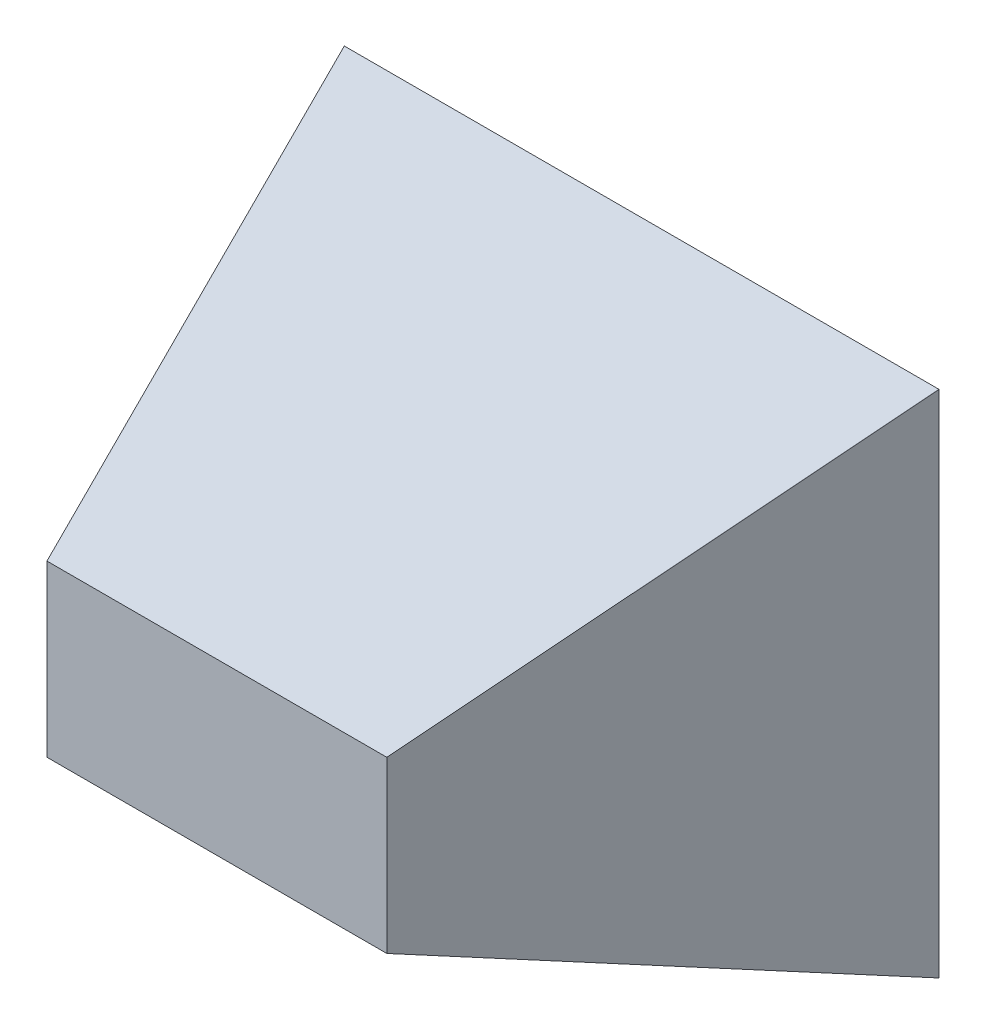
ISO-10303-21;
HEADER;
FILE_DESCRIPTION(('STEP AP214'),'2;1');
FILE_NAME('part.step','',(''),(''),'','','');
FILE_SCHEMA(('AUTOMOTIVE_DESIGN { 1 0 10303 214 1 1 1 1 }'));
ENDSEC;
DATA;
#1=APPLICATION_CONTEXT('core data for automotive mechanical design processes');
#2=APPLICATION_PROTOCOL_DEFINITION('international standard','automotive_design',2000,#1);
#3=PRODUCT_CONTEXT('',#1,'mechanical');
#4=PRODUCT('Part','Part','',(#3));
#5=PRODUCT_RELATED_PRODUCT_CATEGORY('part','',(#4));
#6=PRODUCT_DEFINITION_FORMATION('','',#4);
#7=PRODUCT_DEFINITION_CONTEXT('part definition',#1,'design');
#8=PRODUCT_DEFINITION('design','',#6,#7);
#9=PRODUCT_DEFINITION_SHAPE('','',#8);
#10=(LENGTH_UNIT() NAMED_UNIT(*) SI_UNIT(.MILLI.,.METRE.));
#11=(NAMED_UNIT(*) PLANE_ANGLE_UNIT() SI_UNIT($,.RADIAN.));
#12=(NAMED_UNIT(*) SI_UNIT($,.STERADIAN.) SOLID_ANGLE_UNIT());
#13=UNCERTAINTY_MEASURE_WITH_UNIT(LENGTH_MEASURE(1.E-05),#10,'distance_accuracy_value','');
#14=(GEOMETRIC_REPRESENTATION_CONTEXT(3) GLOBAL_UNCERTAINTY_ASSIGNED_CONTEXT((#13)) GLOBAL_UNIT_ASSIGNED_CONTEXT((#10,
#11,#12)) REPRESENTATION_CONTEXT('',''));
#15=CARTESIAN_POINT('',(0.,0.,0.));
#16=DIRECTION('',(0.,0.,1.));
#17=DIRECTION('',(1.,0.,0.));
#18=AXIS2_PLACEMENT_3D('',#15,#16,#17);
#19=CARTESIAN_POINT('',(-177.8,-152.4,0.));
#20=DIRECTION('',(0.,0.,1.));
#21=DIRECTION('',(1.,0.,0.));
#22=AXIS2_PLACEMENT_3D('',#19,#20,#21);
#23=PLANE('',#22);
#24=CARTESIAN_POINT('',(-177.8,152.4,0.));
#25=CARTESIAN_POINT('',(-177.8,-152.4,0.));
#26=(BOUNDED_CURVE() B_SPLINE_CURVE(1,(#24,#25),.UNSPECIFIED.,.F.,
.F.) B_SPLINE_CURVE_WITH_KNOTS((2,2),(0.,304.8),
.UNSPECIFIED.) CURVE() GEOMETRIC_REPRESENTATION_ITEM() RATIONAL_B_SPLINE_CURVE((1.,1.)) REPRESENTATION_ITEM(''));
#27=CARTESIAN_POINT('',(-177.8,152.4,0.));
#28=VERTEX_POINT('',#27);
#29=CARTESIAN_POINT('',(-177.8,-152.4,0.));
#30=VERTEX_POINT('',#29);
#31=EDGE_CURVE('E43',#28,#30,#26,.T.);
#32=ORIENTED_EDGE('',*,*,#31,.F.);
#33=CARTESIAN_POINT('',(177.8,152.4,0.));
#34=CARTESIAN_POINT('',(-177.8,152.4,0.));
#35=(BOUNDED_CURVE() B_SPLINE_CURVE(1,(#33,#34),.UNSPECIFIED.,.F.,
.F.) B_SPLINE_CURVE_WITH_KNOTS((2,2),(0.,355.6),
.UNSPECIFIED.) CURVE() GEOMETRIC_REPRESENTATION_ITEM() RATIONAL_B_SPLINE_CURVE((1.,1.)) REPRESENTATION_ITEM(''));
#36=CARTESIAN_POINT('',(177.8,152.4,0.));
#37=VERTEX_POINT('',#36);
#38=EDGE_CURVE('E98',#37,#28,#35,.T.);
#39=ORIENTED_EDGE('',*,*,#38,.F.);
#40=CARTESIAN_POINT('',(177.8,-152.4,0.));
#41=CARTESIAN_POINT('',(177.8,152.4,0.));
#42=(BOUNDED_CURVE() B_SPLINE_CURVE(1,(#40,#41),.UNSPECIFIED.,.F.,
.F.) B_SPLINE_CURVE_WITH_KNOTS((2,2),(0.,304.8),
.UNSPECIFIED.) CURVE() GEOMETRIC_REPRESENTATION_ITEM() RATIONAL_B_SPLINE_CURVE((1.,1.)) REPRESENTATION_ITEM(''));
#43=CARTESIAN_POINT('',(177.8,-152.4,0.));
#44=VERTEX_POINT('',#43);
#45=EDGE_CURVE('E80',#44,#37,#42,.T.);
#46=ORIENTED_EDGE('',*,*,#45,.F.);
#47=CARTESIAN_POINT('',(-177.8,-152.4,0.));
#48=CARTESIAN_POINT('',(177.8,-152.4,0.));
#49=(BOUNDED_CURVE() B_SPLINE_CURVE(1,(#47,#48),.UNSPECIFIED.,.F.,
.F.) B_SPLINE_CURVE_WITH_KNOTS((2,2),(0.,355.6),
.UNSPECIFIED.) CURVE() GEOMETRIC_REPRESENTATION_ITEM() RATIONAL_B_SPLINE_CURVE((1.,1.)) REPRESENTATION_ITEM(''));
#50=EDGE_CURVE('E11',#30,#44,#49,.T.);
#51=ORIENTED_EDGE('',*,*,#50,.F.);
#52=EDGE_LOOP('',(#32,#39,#46,#51));
#53=FACE_BOUND('',#52,.T.);
#54=ADVANCED_FACE('F16',(#53),#23,.F.);
#55=CARTESIAN_POINT('',(-179.9336,-50.8,254.));
#56=DIRECTION('',(0.,-0.928476690885259,0.371390676354104));
#57=DIRECTION('',(-1.,0.,0.));
#58=AXIS2_PLACEMENT_3D('',#55,#56,#57);
#59=PLANE('',#58);
#60=ORIENTED_EDGE('',*,*,#50,.T.);
#61=CARTESIAN_POINT('',(101.599999898,-50.8,254.));
#62=CARTESIAN_POINT('',(177.799999912,-152.4,-2.54942733591E-10));
#63=(BOUNDED_CURVE() B_SPLINE_CURVE(1,(#61,#62),.UNSPECIFIED.,.F.,
.F.) B_SPLINE_CURVE_WITH_KNOTS((2,2),(-283.980633146,0.),
.UNSPECIFIED.) CURVE() GEOMETRIC_REPRESENTATION_ITEM() RATIONAL_B_SPLINE_CURVE((1.,1.)) REPRESENTATION_ITEM(''));
#64=CARTESIAN_POINT('',(101.6,-50.7999999747,254.));
#65=VERTEX_POINT('',#64);
#66=EDGE_CURVE('E92',#65,#44,#63,.T.);
#67=ORIENTED_EDGE('',*,*,#66,.F.);
#68=CARTESIAN_POINT('',(101.599999898,-50.8,254.));
#69=CARTESIAN_POINT('',(-101.599999898,-50.8,254.));
#70=(BOUNDED_CURVE() B_SPLINE_CURVE(1,(#68,#69),.UNSPECIFIED.,.F.,
.F.) B_SPLINE_CURVE_WITH_KNOTS((2,2),(0.,203.199999797),
.UNSPECIFIED.) CURVE() GEOMETRIC_REPRESENTATION_ITEM() RATIONAL_B_SPLINE_CURVE((1.,1.)) REPRESENTATION_ITEM(''));
#71=CARTESIAN_POINT('',(-101.599999898,-50.8,254.));
#72=VERTEX_POINT('',#71);
#73=EDGE_CURVE('E29',#65,#72,#70,.T.);
#74=ORIENTED_EDGE('',*,*,#73,.T.);
#75=CARTESIAN_POINT('',(-101.599999898,-50.8,254.));
#76=CARTESIAN_POINT('',(-177.799999912,-152.4,-2.54942733591E-10));
#77=(BOUNDED_CURVE() B_SPLINE_CURVE(1,(#75,#76),.UNSPECIFIED.,.F.,
.F.) B_SPLINE_CURVE_WITH_KNOTS((2,2),(0.,283.980633146),
.UNSPECIFIED.) CURVE() GEOMETRIC_REPRESENTATION_ITEM() RATIONAL_B_SPLINE_CURVE((1.,1.)) REPRESENTATION_ITEM(''));
#78=EDGE_CURVE('E64',#72,#30,#77,.T.);
#79=ORIENTED_EDGE('',*,*,#78,.T.);
#80=EDGE_LOOP('',(#60,#67,#74,#79));
#81=FACE_BOUND('',#80,.T.);
#82=ADVANCED_FACE('F176',(#81),#59,.T.);
#83=CARTESIAN_POINT('',(101.6,-154.2288,254.));
#84=DIRECTION('',(0.957826285221234,0.,0.28734788556607));
#85=DIRECTION('',(0.,-1.,0.));
#86=AXIS2_PLACEMENT_3D('',#83,#84,#85);
#87=PLANE('',#86);
#88=CARTESIAN_POINT('',(101.6,50.799999975,254.));
#89=CARTESIAN_POINT('',(101.6,-50.7999999747,254.));
#90=(BOUNDED_CURVE() B_SPLINE_CURVE(1,(#88,#89),.UNSPECIFIED.,.F.,
.F.) B_SPLINE_CURVE_WITH_KNOTS((2,2),(0.,101.59999995),
.UNSPECIFIED.) CURVE() GEOMETRIC_REPRESENTATION_ITEM() RATIONAL_B_SPLINE_CURVE((1.,1.)) REPRESENTATION_ITEM(''));
#91=CARTESIAN_POINT('',(101.6,50.799999975,254.));
#92=VERTEX_POINT('',#91);
#93=EDGE_CURVE('E79',#92,#65,#90,.T.);
#94=ORIENTED_EDGE('',*,*,#93,.T.);
#95=ORIENTED_EDGE('',*,*,#66,.T.);
#96=ORIENTED_EDGE('',*,*,#45,.T.);
#97=CARTESIAN_POINT('',(177.8,152.399999925,-2.54942733591E-10));
#98=CARTESIAN_POINT('',(101.6,50.799999975,254.));
#99=(BOUNDED_CURVE() B_SPLINE_CURVE(1,(#97,#98),.UNSPECIFIED.,.F.,
.F.) B_SPLINE_CURVE_WITH_KNOTS((2,2),(0.,283.980633125),
.UNSPECIFIED.) CURVE() GEOMETRIC_REPRESENTATION_ITEM() RATIONAL_B_SPLINE_CURVE((1.,1.)) REPRESENTATION_ITEM(''));
#100=EDGE_CURVE('E76',#37,#92,#99,.T.);
#101=ORIENTED_EDGE('',*,*,#100,.T.);
#102=EDGE_LOOP('',(#94,#95,#96,#101));
#103=FACE_BOUND('',#102,.T.);
#104=ADVANCED_FACE('F18',(#103),#87,.T.);
#105=CARTESIAN_POINT('',(-179.9336,152.4,0.));
#106=DIRECTION('',(0.,0.928476690885259,0.371390676354104));
#107=DIRECTION('',(1.,0.,0.));
#108=AXIS2_PLACEMENT_3D('',#105,#106,#107);
#109=PLANE('',#108);
#110=CARTESIAN_POINT('',(-101.599999898,50.7999999999,254.));
#111=CARTESIAN_POINT('',(101.599999898,50.7999999999,254.));
#112=(BOUNDED_CURVE() B_SPLINE_CURVE(1,(#110,#111),.UNSPECIFIED.,.F.,
.F.) B_SPLINE_CURVE_WITH_KNOTS((2,2),(0.,203.199999797),
.UNSPECIFIED.) CURVE() GEOMETRIC_REPRESENTATION_ITEM() RATIONAL_B_SPLINE_CURVE((1.,1.)) REPRESENTATION_ITEM(''));
#113=CARTESIAN_POINT('',(-101.6,50.799999975,254.));
#114=VERTEX_POINT('',#113);
#115=EDGE_CURVE('E84',#114,#92,#112,.T.);
#116=ORIENTED_EDGE('',*,*,#115,.T.);
#117=ORIENTED_EDGE('',*,*,#100,.F.);
#118=ORIENTED_EDGE('',*,*,#38,.T.);
#119=CARTESIAN_POINT('',(-101.599999898,50.7999999999,254.));
#120=CARTESIAN_POINT('',(-177.799999912,152.4,0.));
#121=(BOUNDED_CURVE() B_SPLINE_CURVE(1,(#119,#120),.UNSPECIFIED.,.F.,
.F.) B_SPLINE_CURVE_WITH_KNOTS((2,2),(-283.980633146,0.),
.UNSPECIFIED.) CURVE() GEOMETRIC_REPRESENTATION_ITEM() RATIONAL_B_SPLINE_CURVE((1.,1.)) REPRESENTATION_ITEM(''));
#122=EDGE_CURVE('E96',#114,#28,#121,.T.);
#123=ORIENTED_EDGE('',*,*,#122,.F.);
#124=EDGE_LOOP('',(#116,#117,#118,#123));
#125=FACE_BOUND('',#124,.T.);
#126=ADVANCED_FACE('F94',(#125),#109,.T.);
#127=CARTESIAN_POINT('',(-177.8,-154.2288,0.));
#128=DIRECTION('',(-0.957826285221234,0.,0.28734788556607));
#129=DIRECTION('',(0.,1.,0.));
#130=AXIS2_PLACEMENT_3D('',#127,#128,#129);
#131=PLANE('',#130);
#132=ORIENTED_EDGE('',*,*,#31,.T.);
#133=ORIENTED_EDGE('',*,*,#78,.F.);
#134=CARTESIAN_POINT('',(-101.6,-50.7999999747,254.));
#135=CARTESIAN_POINT('',(-101.6,50.799999975,254.));
#136=(BOUNDED_CURVE() B_SPLINE_CURVE(1,(#134,#135),.UNSPECIFIED.,.F.,
.F.) B_SPLINE_CURVE_WITH_KNOTS((2,2),(0.,101.59999995),
.UNSPECIFIED.) CURVE() GEOMETRIC_REPRESENTATION_ITEM() RATIONAL_B_SPLINE_CURVE((1.,1.)) REPRESENTATION_ITEM(''));
#137=EDGE_CURVE('E20',#72,#114,#136,.T.);
#138=ORIENTED_EDGE('',*,*,#137,.T.);
#139=ORIENTED_EDGE('',*,*,#122,.T.);
#140=EDGE_LOOP('',(#132,#133,#138,#139));
#141=FACE_BOUND('',#140,.T.);
#142=ADVANCED_FACE('F165',(#141),#131,.T.);
#143=CARTESIAN_POINT('',(-101.6,-50.8,254.));
#144=DIRECTION('',(0.,0.,1.));
#145=DIRECTION('',(1.,0.,0.));
#146=AXIS2_PLACEMENT_3D('',#143,#144,#145);
#147=PLANE('',#146);
#148=ORIENTED_EDGE('',*,*,#137,.F.);
#149=ORIENTED_EDGE('',*,*,#73,.F.);
#150=ORIENTED_EDGE('',*,*,#93,.F.);
#151=ORIENTED_EDGE('',*,*,#115,.F.);
#152=EDGE_LOOP('',(#148,#149,#150,#151));
#153=FACE_BOUND('',#152,.T.);
#154=ADVANCED_FACE('F90',(#153),#147,.T.);
#155=CLOSED_SHELL('',(#54,#82,#104,#126,#142,#154));
#156=MANIFOLD_SOLID_BREP('B1',#155);
#157=ADVANCED_BREP_SHAPE_REPRESENTATION('',(#18,#156),#14);
#158=SHAPE_DEFINITION_REPRESENTATION(#9,#157);
ENDSEC;
END-ISO-10303-21;
